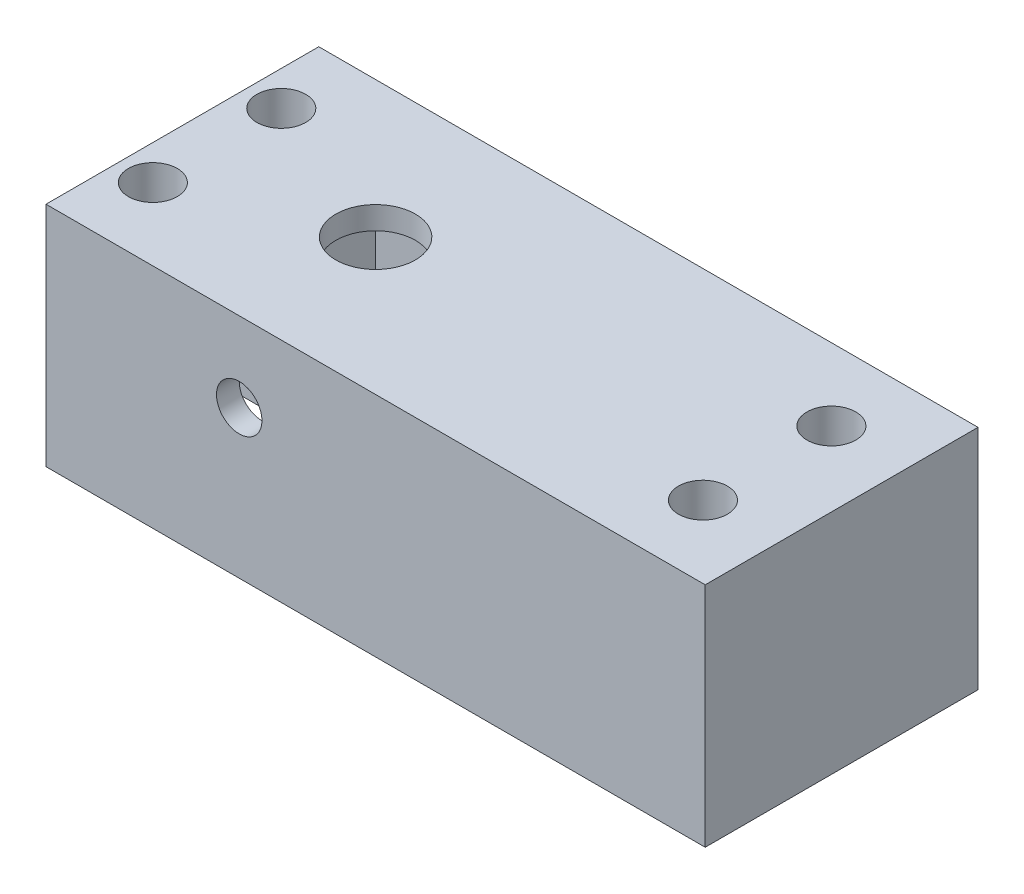
ISO-10303-21;
HEADER;
FILE_DESCRIPTION(('STEP AP214'),'2;1');
FILE_NAME('part.step','',(''),(''),'','','');
FILE_SCHEMA(('AUTOMOTIVE_DESIGN { 1 0 10303 214 1 1 1 1 }'));
ENDSEC;
DATA;
#1=APPLICATION_CONTEXT('core data for automotive mechanical design processes');
#2=APPLICATION_PROTOCOL_DEFINITION('international standard','automotive_design',2000,#1);
#3=PRODUCT_CONTEXT('',#1,'mechanical');
#4=PRODUCT('Part','Part','',(#3));
#5=PRODUCT_RELATED_PRODUCT_CATEGORY('part','',(#4));
#6=PRODUCT_DEFINITION_FORMATION('','',#4);
#7=PRODUCT_DEFINITION_CONTEXT('part definition',#1,'design');
#8=PRODUCT_DEFINITION('design','',#6,#7);
#9=PRODUCT_DEFINITION_SHAPE('','',#8);
#10=(LENGTH_UNIT() NAMED_UNIT(*) SI_UNIT(.MILLI.,.METRE.));
#11=(NAMED_UNIT(*) PLANE_ANGLE_UNIT() SI_UNIT($,.RADIAN.));
#12=(NAMED_UNIT(*) SI_UNIT($,.STERADIAN.) SOLID_ANGLE_UNIT());
#13=UNCERTAINTY_MEASURE_WITH_UNIT(LENGTH_MEASURE(1.E-05),#10,'distance_accuracy_value','');
#14=(GEOMETRIC_REPRESENTATION_CONTEXT(3) GLOBAL_UNCERTAINTY_ASSIGNED_CONTEXT((#13)) GLOBAL_UNIT_ASSIGNED_CONTEXT((#10,
#11,#12)) REPRESENTATION_CONTEXT('',''));
#15=CARTESIAN_POINT('',(0.,0.,0.));
#16=DIRECTION('',(0.,0.,1.));
#17=DIRECTION('',(1.,0.,0.));
#18=AXIS2_PLACEMENT_3D('',#15,#16,#17);
#19=CARTESIAN_POINT('',(0.,0.,2.));
#20=DIRECTION('',(0.,0.,1.));
#21=DIRECTION('',(1.,0.,0.));
#22=AXIS2_PLACEMENT_3D('',#19,#20,#21);
#23=PLANE('',#22);
#24=CARTESIAN_POINT('',(-17.348648349237,-5.,2.));
#25=DIRECTION('',(0.,0.,-1.));
#26=DIRECTION('',(-1.,0.,0.));
#27=AXIS2_PLACEMENT_3D('',#24,#25,#26);
#28=CIRCLE('',#27,2.);
#29=CARTESIAN_POINT('',(-19.348648349237,-5.,2.));
#30=VERTEX_POINT('',#29);
#31=EDGE_CURVE('E270',#30,#30,#28,.T.);
#32=ORIENTED_EDGE('',*,*,#31,.T.);
#33=EDGE_LOOP('',(#32));
#34=FACE_BOUND('',#33,.T.);
#35=DIRECTION('',(1.,0.,0.));
#36=VECTOR('',#35,1.);
#37=CARTESIAN_POINT('',(20.651351650763,-18.,2.));
#38=LINE('',#37,#36);
#39=CARTESIAN_POINT('',(-34.348648349237,-18.,2.));
#40=VERTEX_POINT('',#39);
#41=CARTESIAN_POINT('',(23.651351650763,-18.,2.));
#42=VERTEX_POINT('',#41);
#43=EDGE_CURVE('E208',#40,#42,#38,.T.);
#44=ORIENTED_EDGE('',*,*,#43,.T.);
#45=DIRECTION('',(0.,-1.,0.));
#46=VECTOR('',#45,1.);
#47=CARTESIAN_POINT('',(23.651351650763,2.,2.));
#48=LINE('',#47,#46);
#49=CARTESIAN_POINT('',(23.651351650763,2.,2.));
#50=VERTEX_POINT('',#49);
#51=EDGE_CURVE('E259',#50,#42,#48,.T.);
#52=ORIENTED_EDGE('',*,*,#51,.F.);
#53=DIRECTION('',(1.,0.,0.));
#54=VECTOR('',#53,1.);
#55=CARTESIAN_POINT('',(-34.348648349237,2.,2.));
#56=LINE('',#55,#54);
#57=CARTESIAN_POINT('',(-34.348648349237,2.,2.));
#58=VERTEX_POINT('',#57);
#59=EDGE_CURVE('E202',#58,#50,#56,.T.);
#60=ORIENTED_EDGE('',*,*,#59,.F.);
#61=DIRECTION('',(0.,-1.,0.));
#62=VECTOR('',#61,1.);
#63=CARTESIAN_POINT('',(-34.348648349237,-18.,2.));
#64=LINE('',#63,#62);
#65=EDGE_CURVE('E205',#58,#40,#64,.T.);
#66=ORIENTED_EDGE('',*,*,#65,.T.);
#67=EDGE_LOOP('',(#44,#52,#60,#66));
#68=FACE_BOUND('',#67,.T.);
#69=ADVANCED_FACE('F39',(#34,#68),#23,.T.);
#70=CARTESIAN_POINT('',(0.,0.,-22.));
#71=DIRECTION('',(0.,0.,-1.));
#72=DIRECTION('',(-1.,0.,0.));
#73=AXIS2_PLACEMENT_3D('',#70,#71,#72);
#74=PLANE('',#73);
#75=CARTESIAN_POINT('',(-17.348648349237,-5.,-22.));
#76=DIRECTION('',(0.,0.,-1.));
#77=DIRECTION('',(-1.,0.,0.));
#78=AXIS2_PLACEMENT_3D('',#75,#76,#77);
#79=CIRCLE('',#78,2.);
#80=CARTESIAN_POINT('',(-19.348648349237,-5.,-22.));
#81=VERTEX_POINT('',#80);
#82=EDGE_CURVE('E265',#81,#81,#79,.T.);
#83=ORIENTED_EDGE('',*,*,#82,.F.);
#84=EDGE_LOOP('',(#83));
#85=FACE_BOUND('',#84,.T.);
#86=DIRECTION('',(-1.,0.,0.));
#87=VECTOR('',#86,1.);
#88=CARTESIAN_POINT('',(30.651351650763,2.,-22.));
#89=LINE('',#88,#87);
#90=CARTESIAN_POINT('',(23.651351650763,2.,-22.));
#91=VERTEX_POINT('',#90);
#92=CARTESIAN_POINT('',(-34.348648349237,2.,-22.));
#93=VERTEX_POINT('',#92);
#94=EDGE_CURVE('E276',#91,#93,#89,.T.);
#95=ORIENTED_EDGE('',*,*,#94,.F.);
#96=DIRECTION('',(0.,1.,0.));
#97=VECTOR('',#96,1.);
#98=CARTESIAN_POINT('',(23.651351650763,-18.,-22.));
#99=LINE('',#98,#97);
#100=CARTESIAN_POINT('',(23.651351650763,-18.,-22.));
#101=VERTEX_POINT('',#100);
#102=EDGE_CURVE('E63',#101,#91,#99,.T.);
#103=ORIENTED_EDGE('',*,*,#102,.F.);
#104=DIRECTION('',(-1.,0.,0.));
#105=VECTOR('',#104,1.);
#106=CARTESIAN_POINT('',(-34.348648349237,-18.,-22.));
#107=LINE('',#106,#105);
#108=CARTESIAN_POINT('',(-34.348648349237,-18.,-22.));
#109=VERTEX_POINT('',#108);
#110=EDGE_CURVE('E206',#101,#109,#107,.T.);
#111=ORIENTED_EDGE('',*,*,#110,.T.);
#112=DIRECTION('',(0.,1.,0.));
#113=VECTOR('',#112,1.);
#114=CARTESIAN_POINT('',(-34.348648349237,-18.,-22.));
#115=LINE('',#114,#113);
#116=EDGE_CURVE('E201',#109,#93,#115,.T.);
#117=ORIENTED_EDGE('',*,*,#116,.T.);
#118=EDGE_LOOP('',(#95,#103,#111,#117));
#119=FACE_BOUND('',#118,.T.);
#120=ADVANCED_FACE('F228',(#85,#119),#74,.T.);
#121=CARTESIAN_POINT('',(0.,-18.,0.));
#122=DIRECTION('',(0.,-1.,0.));
#123=DIRECTION('',(0.,0.,-1.));
#124=AXIS2_PLACEMENT_3D('',#121,#122,#123);
#125=PLANE('',#124);
#126=DIRECTION('',(1.,0.,0.));
#127=VECTOR('',#126,1.);
#128=CARTESIAN_POINT('',(0.,-18.,-12.));
#129=LINE('',#128,#127);
#130=CARTESIAN_POINT('',(-34.348648349237,-18.,-12.));
#131=VERTEX_POINT('',#130);
#132=CARTESIAN_POINT('',(-27.348648349237,-18.,-12.));
#133=VERTEX_POINT('',#132);
#134=EDGE_CURVE('E139',#131,#133,#129,.T.);
#135=ORIENTED_EDGE('',*,*,#134,.F.);
#136=DIRECTION('',(0.,0.,-1.));
#137=VECTOR('',#136,1.);
#138=CARTESIAN_POINT('',(-34.348648349237,-18.,0.));
#139=LINE('',#138,#137);
#140=EDGE_CURVE('E160',#131,#109,#139,.T.);
#141=ORIENTED_EDGE('',*,*,#140,.T.);
#142=ORIENTED_EDGE('',*,*,#110,.F.);
#143=DIRECTION('',(0.,0.,-1.));
#144=VECTOR('',#143,1.);
#145=CARTESIAN_POINT('',(23.651351650763,-18.,2.));
#146=LINE('',#145,#144);
#147=EDGE_CURVE('E245',#42,#101,#146,.T.);
#148=ORIENTED_EDGE('',*,*,#147,.F.);
#149=ORIENTED_EDGE('',*,*,#43,.F.);
#150=CARTESIAN_POINT('',(-34.348648349237,-18.,-8.));
#151=VERTEX_POINT('',#150);
#152=EDGE_CURVE('E151',#40,#151,#139,.T.);
#153=ORIENTED_EDGE('',*,*,#152,.T.);
#154=DIRECTION('',(-1.,0.,0.));
#155=VECTOR('',#154,1.);
#156=CARTESIAN_POINT('',(0.,-18.,-8.));
#157=LINE('',#156,#155);
#158=CARTESIAN_POINT('',(-27.348648349237,-18.,-8.));
#159=VERTEX_POINT('',#158);
#160=EDGE_CURVE('E130',#159,#151,#157,.T.);
#161=ORIENTED_EDGE('',*,*,#160,.F.);
#162=DIRECTION('',(0.,0.,1.));
#163=VECTOR('',#162,1.);
#164=CARTESIAN_POINT('',(-27.348648349237,-18.,0.));
#165=LINE('',#164,#163);
#166=CARTESIAN_POINT('',(-27.348648349237,-18.,0.));
#167=VERTEX_POINT('',#166);
#168=EDGE_CURVE('E147',#159,#167,#165,.T.);
#169=ORIENTED_EDGE('',*,*,#168,.T.);
#170=DIRECTION('',(1.,0.,0.));
#171=VECTOR('',#170,1.);
#172=CARTESIAN_POINT('',(20.651351650763,-18.,0.));
#173=LINE('',#172,#171);
#174=CARTESIAN_POINT('',(13.651351650763,-18.,0.));
#175=VERTEX_POINT('',#174);
#176=EDGE_CURVE('E204',#167,#175,#173,.T.);
#177=ORIENTED_EDGE('',*,*,#176,.T.);
#178=DIRECTION('',(0.,0.,-1.));
#179=VECTOR('',#178,1.);
#180=CARTESIAN_POINT('',(13.651351650763,-18.,-20.));
#181=LINE('',#180,#179);
#182=CARTESIAN_POINT('',(13.651351650763,-18.,-20.));
#183=VERTEX_POINT('',#182);
#184=EDGE_CURVE('E186',#175,#183,#181,.T.);
#185=ORIENTED_EDGE('',*,*,#184,.T.);
#186=DIRECTION('',(-1.,0.,0.));
#187=VECTOR('',#186,1.);
#188=CARTESIAN_POINT('',(-34.348648349237,-18.,-20.));
#189=LINE('',#188,#187);
#190=CARTESIAN_POINT('',(-27.348648349237,-18.,-20.));
#191=VERTEX_POINT('',#190);
#192=EDGE_CURVE('E199',#183,#191,#189,.T.);
#193=ORIENTED_EDGE('',*,*,#192,.T.);
#194=EDGE_CURVE('E157',#191,#133,#165,.T.);
#195=ORIENTED_EDGE('',*,*,#194,.T.);
#196=EDGE_LOOP('',(#135,#141,#142,#148,#149,#153,#161,#169,#177,#185,#193,#195));
#197=FACE_BOUND('',#196,.T.);
#198=CARTESIAN_POINT('',(-31.2986483492361,-18.,-4.3499999999994));
#199=DIRECTION('',(0.,-1.,0.));
#200=DIRECTION('',(0.,0.,-1.));
#201=AXIS2_PLACEMENT_3D('',#198,#199,#200);
#202=CIRCLE('',#201,2.14999999999999);
#203=CARTESIAN_POINT('',(-31.2986483492361,-18.,-6.49999999999939));
#204=VERTEX_POINT('',#203);
#205=EDGE_CURVE('E193',#204,#204,#202,.T.);
#206=ORIENTED_EDGE('',*,*,#205,.F.);
#207=EDGE_LOOP('',(#206));
#208=FACE_BOUND('',#207,.T.);
#209=CARTESIAN_POINT('',(-31.2986483492361,-18.,-15.6499999999994));
#210=DIRECTION('',(0.,-1.,0.));
#211=DIRECTION('',(0.,0.,-1.));
#212=AXIS2_PLACEMENT_3D('',#209,#210,#211);
#213=CIRCLE('',#212,2.14999999999999);
#214=CARTESIAN_POINT('',(-31.2986483492361,-18.,-17.7999999999994));
#215=VERTEX_POINT('',#214);
#216=EDGE_CURVE('E189',#215,#215,#213,.T.);
#217=ORIENTED_EDGE('',*,*,#216,.F.);
#218=EDGE_LOOP('',(#217));
#219=FACE_BOUND('',#218,.T.);
#220=CARTESIAN_POINT('',(17.101351650764,-18.,-4.34999999999941));
#221=DIRECTION('',(0.,-1.,0.));
#222=DIRECTION('',(0.,0.,-1.));
#223=AXIS2_PLACEMENT_3D('',#220,#221,#222);
#224=CIRCLE('',#223,2.15);
#225=CARTESIAN_POINT('',(17.101351650764,-18.,-6.49999999999941));
#226=VERTEX_POINT('',#225);
#227=EDGE_CURVE('E214',#226,#226,#224,.T.);
#228=ORIENTED_EDGE('',*,*,#227,.F.);
#229=EDGE_LOOP('',(#228));
#230=FACE_BOUND('',#229,.T.);
#231=CARTESIAN_POINT('',(17.1013516507639,-18.,-15.6499999999994));
#232=DIRECTION('',(0.,-1.,0.));
#233=DIRECTION('',(0.,0.,-1.));
#234=AXIS2_PLACEMENT_3D('',#231,#232,#233);
#235=CIRCLE('',#234,2.15);
#236=CARTESIAN_POINT('',(17.1013516507639,-18.,-17.7999999999994));
#237=VERTEX_POINT('',#236);
#238=EDGE_CURVE('E217',#237,#237,#235,.T.);
#239=ORIENTED_EDGE('',*,*,#238,.F.);
#240=EDGE_LOOP('',(#239));
#241=FACE_BOUND('',#240,.T.);
#242=ADVANCED_FACE('F144',(#197,#208,#219,#230,#241),#125,.T.);
#243=CARTESIAN_POINT('',(0.,2.,0.));
#244=DIRECTION('',(0.,1.,0.));
#245=DIRECTION('',(0.,0.,1.));
#246=AXIS2_PLACEMENT_3D('',#243,#244,#245);
#247=PLANE('',#246);
#248=CARTESIAN_POINT('',(17.101351650764,2.,-4.34999999999941));
#249=DIRECTION('',(0.,-1.,0.));
#250=DIRECTION('',(0.,0.,-1.));
#251=AXIS2_PLACEMENT_3D('',#248,#249,#250);
#252=CIRCLE('',#251,2.15);
#253=CARTESIAN_POINT('',(17.101351650764,2.,-6.49999999999941));
#254=VERTEX_POINT('',#253);
#255=EDGE_CURVE('E246',#254,#254,#252,.T.);
#256=ORIENTED_EDGE('',*,*,#255,.T.);
#257=EDGE_LOOP('',(#256));
#258=FACE_BOUND('',#257,.T.);
#259=CARTESIAN_POINT('',(-31.2986483492361,2.,-15.6499999999994));
#260=DIRECTION('',(0.,-1.,0.));
#261=DIRECTION('',(0.,0.,-1.));
#262=AXIS2_PLACEMENT_3D('',#259,#260,#261);
#263=CIRCLE('',#262,2.14999999999999);
#264=CARTESIAN_POINT('',(-31.2986483492361,2.,-17.7999999999994));
#265=VERTEX_POINT('',#264);
#266=EDGE_CURVE('E250',#265,#265,#263,.T.);
#267=ORIENTED_EDGE('',*,*,#266,.T.);
#268=EDGE_LOOP('',(#267));
#269=FACE_BOUND('',#268,.T.);
#270=CARTESIAN_POINT('',(-31.2986483492361,2.,-4.3499999999994));
#271=DIRECTION('',(0.,-1.,0.));
#272=DIRECTION('',(0.,0.,-1.));
#273=AXIS2_PLACEMENT_3D('',#270,#271,#272);
#274=CIRCLE('',#273,2.14999999999999);
#275=CARTESIAN_POINT('',(-31.2986483492361,2.,-6.49999999999939));
#276=VERTEX_POINT('',#275);
#277=EDGE_CURVE('E253',#276,#276,#274,.T.);
#278=ORIENTED_EDGE('',*,*,#277,.T.);
#279=EDGE_LOOP('',(#278));
#280=FACE_BOUND('',#279,.T.);
#281=CARTESIAN_POINT('',(17.1013516507639,2.,-15.6499999999994));
#282=DIRECTION('',(0.,-1.,0.));
#283=DIRECTION('',(0.,0.,-1.));
#284=AXIS2_PLACEMENT_3D('',#281,#282,#283);
#285=CIRCLE('',#284,2.15);
#286=CARTESIAN_POINT('',(17.1013516507639,2.,-17.7999999999994));
#287=VERTEX_POINT('',#286);
#288=EDGE_CURVE('E243',#287,#287,#285,.T.);
#289=ORIENTED_EDGE('',*,*,#288,.T.);
#290=EDGE_LOOP('',(#289));
#291=FACE_BOUND('',#290,.T.);
#292=CARTESIAN_POINT('',(-17.348648349237,2.,-10.));
#293=DIRECTION('',(0.,-1.,0.));
#294=DIRECTION('',(0.,0.,-1.));
#295=AXIS2_PLACEMENT_3D('',#292,#293,#294);
#296=CIRCLE('',#295,3.5);
#297=CARTESIAN_POINT('',(-17.348648349237,2.,-13.5));
#298=VERTEX_POINT('',#297);
#299=EDGE_CURVE('E262',#298,#298,#296,.T.);
#300=ORIENTED_EDGE('',*,*,#299,.T.);
#301=EDGE_LOOP('',(#300));
#302=FACE_BOUND('',#301,.T.);
#303=ORIENTED_EDGE('',*,*,#59,.T.);
#304=DIRECTION('',(0.,0.,1.));
#305=VECTOR('',#304,1.);
#306=CARTESIAN_POINT('',(23.651351650763,2.,-22.));
#307=LINE('',#306,#305);
#308=EDGE_CURVE('E257',#91,#50,#307,.T.);
#309=ORIENTED_EDGE('',*,*,#308,.F.);
#310=ORIENTED_EDGE('',*,*,#94,.T.);
#311=DIRECTION('',(0.,0.,1.));
#312=VECTOR('',#311,1.);
#313=CARTESIAN_POINT('',(-34.348648349237,2.,-22.));
#314=LINE('',#313,#312);
#315=EDGE_CURVE('E278',#93,#58,#314,.T.);
#316=ORIENTED_EDGE('',*,*,#315,.T.);
#317=EDGE_LOOP('',(#303,#309,#310,#316));
#318=FACE_BOUND('',#317,.T.);
#319=ADVANCED_FACE('F227',(#258,#269,#280,#291,#302,#318),#247,.T.);
#320=CARTESIAN_POINT('',(-34.348648349237,7.,0.));
#321=DIRECTION('',(1.,0.,0.));
#322=DIRECTION('',(0.,0.,-1.));
#323=AXIS2_PLACEMENT_3D('',#320,#321,#322);
#324=PLANE('',#323);
#325=ORIENTED_EDGE('',*,*,#140,.F.);
#326=DIRECTION('',(0.,-1.,0.));
#327=VECTOR('',#326,1.);
#328=CARTESIAN_POINT('',(-34.348648349237,8.06225774829855,-12.));
#329=LINE('',#328,#327);
#330=CARTESIAN_POINT('',(-34.348648349237,-1.,-12.));
#331=VERTEX_POINT('',#330);
#332=EDGE_CURVE('E304',#331,#131,#329,.T.);
#333=ORIENTED_EDGE('',*,*,#332,.F.);
#334=DIRECTION('',(0.,0.,1.));
#335=VECTOR('',#334,1.);
#336=CARTESIAN_POINT('',(-34.348648349237,-1.,0.));
#337=LINE('',#336,#335);
#338=CARTESIAN_POINT('',(-34.348648349237,-1.,-8.));
#339=VERTEX_POINT('',#338);
#340=EDGE_CURVE('E303',#331,#339,#337,.T.);
#341=ORIENTED_EDGE('',*,*,#340,.T.);
#342=DIRECTION('',(0.,-1.,0.));
#343=VECTOR('',#342,1.);
#344=CARTESIAN_POINT('',(-34.348648349237,8.06225774829855,-8.));
#345=LINE('',#344,#343);
#346=EDGE_CURVE('E138',#339,#151,#345,.T.);
#347=ORIENTED_EDGE('',*,*,#346,.T.);
#348=ORIENTED_EDGE('',*,*,#152,.F.);
#349=ORIENTED_EDGE('',*,*,#65,.F.);
#350=ORIENTED_EDGE('',*,*,#315,.F.);
#351=ORIENTED_EDGE('',*,*,#116,.F.);
#352=EDGE_LOOP('',(#325,#333,#341,#347,#348,#349,#350,#351));
#353=FACE_BOUND('',#352,.T.);
#354=ADVANCED_FACE('F41',(#353),#324,.F.);
#355=CARTESIAN_POINT('',(0.,0.,0.));
#356=DIRECTION('',(0.,-1.,0.));
#357=DIRECTION('',(0.,0.,-1.));
#358=AXIS2_PLACEMENT_3D('',#355,#356,#357);
#359=PLANE('',#358);
#360=CARTESIAN_POINT('',(-17.348648349237,0.,-10.));
#361=DIRECTION('',(0.,-1.,0.));
#362=DIRECTION('',(0.,0.,-1.));
#363=AXIS2_PLACEMENT_3D('',#360,#361,#362);
#364=CIRCLE('',#363,3.5);
#365=CARTESIAN_POINT('',(-17.348648349237,0.,-13.5));
#366=VERTEX_POINT('',#365);
#367=EDGE_CURVE('E261',#366,#366,#364,.T.);
#368=ORIENTED_EDGE('',*,*,#367,.F.);
#369=EDGE_LOOP('',(#368));
#370=FACE_BOUND('',#369,.T.);
#371=DIRECTION('',(-1.,0.,0.));
#372=VECTOR('',#371,1.);
#373=CARTESIAN_POINT('',(-34.348648349237,0.,-20.));
#374=LINE('',#373,#372);
#375=CARTESIAN_POINT('',(13.651351650763,0.,-20.));
#376=VERTEX_POINT('',#375);
#377=CARTESIAN_POINT('',(-27.348648349237,0.,-20.));
#378=VERTEX_POINT('',#377);
#379=EDGE_CURVE('E13',#376,#378,#374,.T.);
#380=ORIENTED_EDGE('',*,*,#379,.F.);
#381=DIRECTION('',(0.,0.,-1.));
#382=VECTOR('',#381,1.);
#383=CARTESIAN_POINT('',(13.651351650763,0.,-20.));
#384=LINE('',#383,#382);
#385=CARTESIAN_POINT('',(13.651351650763,0.,0.));
#386=VERTEX_POINT('',#385);
#387=EDGE_CURVE('E183',#386,#376,#384,.T.);
#388=ORIENTED_EDGE('',*,*,#387,.F.);
#389=DIRECTION('',(1.,0.,0.));
#390=VECTOR('',#389,1.);
#391=CARTESIAN_POINT('',(-34.348648349237,0.,0.));
#392=LINE('',#391,#390);
#393=CARTESIAN_POINT('',(-27.348648349237,0.,0.));
#394=VERTEX_POINT('',#393);
#395=EDGE_CURVE('E48',#394,#386,#392,.T.);
#396=ORIENTED_EDGE('',*,*,#395,.F.);
#397=DIRECTION('',(0.,0.,1.));
#398=VECTOR('',#397,1.);
#399=CARTESIAN_POINT('',(-27.348648349237,0.,0.));
#400=LINE('',#399,#398);
#401=EDGE_CURVE('E164',#378,#394,#400,.T.);
#402=ORIENTED_EDGE('',*,*,#401,.F.);
#403=EDGE_LOOP('',(#380,#388,#396,#402));
#404=FACE_BOUND('',#403,.T.);
#405=ADVANCED_FACE('F188',(#370,#404),#359,.T.);
#406=CARTESIAN_POINT('',(-27.348648349237,-18.,0.));
#407=DIRECTION('',(-1.,0.,0.));
#408=DIRECTION('',(0.,0.,1.));
#409=AXIS2_PLACEMENT_3D('',#406,#407,#408);
#410=PLANE('',#409);
#411=DIRECTION('',(0.,0.,-1.));
#412=VECTOR('',#411,1.);
#413=CARTESIAN_POINT('',(-27.348648349237,-1.,0.));
#414=LINE('',#413,#412);
#415=CARTESIAN_POINT('',(-27.348648349237,-1.,-8.));
#416=VERTEX_POINT('',#415);
#417=CARTESIAN_POINT('',(-27.348648349237,-1.,-12.));
#418=VERTEX_POINT('',#417);
#419=EDGE_CURVE('E307',#416,#418,#414,.T.);
#420=ORIENTED_EDGE('',*,*,#419,.T.);
#421=DIRECTION('',(0.,-1.,0.));
#422=VECTOR('',#421,1.);
#423=CARTESIAN_POINT('',(-27.348648349237,8.06225774829855,-12.));
#424=LINE('',#423,#422);
#425=EDGE_CURVE('E55',#418,#133,#424,.T.);
#426=ORIENTED_EDGE('',*,*,#425,.T.);
#427=ORIENTED_EDGE('',*,*,#194,.F.);
#428=DIRECTION('',(0.,1.,0.));
#429=VECTOR('',#428,1.);
#430=CARTESIAN_POINT('',(-27.348648349237,-18.,-20.));
#431=LINE('',#430,#429);
#432=EDGE_CURVE('E168',#191,#378,#431,.T.);
#433=ORIENTED_EDGE('',*,*,#432,.T.);
#434=ORIENTED_EDGE('',*,*,#401,.T.);
#435=DIRECTION('',(0.,1.,0.));
#436=VECTOR('',#435,1.);
#437=CARTESIAN_POINT('',(-27.348648349237,-18.,0.));
#438=LINE('',#437,#436);
#439=EDGE_CURVE('E156',#167,#394,#438,.T.);
#440=ORIENTED_EDGE('',*,*,#439,.F.);
#441=ORIENTED_EDGE('',*,*,#168,.F.);
#442=DIRECTION('',(0.,-1.,0.));
#443=VECTOR('',#442,1.);
#444=CARTESIAN_POINT('',(-27.348648349237,8.06225774829855,-8.));
#445=LINE('',#444,#443);
#446=EDGE_CURVE('E127',#416,#159,#445,.T.);
#447=ORIENTED_EDGE('',*,*,#446,.F.);
#448=EDGE_LOOP('',(#420,#426,#427,#433,#434,#440,#441,#447));
#449=FACE_BOUND('',#448,.T.);
#450=ADVANCED_FACE('F154',(#449),#410,.F.);
#451=CARTESIAN_POINT('',(13.651351650763,-18.,-20.));
#452=DIRECTION('',(1.,0.,0.));
#453=DIRECTION('',(0.,0.,-1.));
#454=AXIS2_PLACEMENT_3D('',#451,#452,#453);
#455=PLANE('',#454);
#456=ORIENTED_EDGE('',*,*,#387,.T.);
#457=DIRECTION('',(0.,1.,0.));
#458=VECTOR('',#457,1.);
#459=CARTESIAN_POINT('',(13.651351650763,-18.,-20.));
#460=LINE('',#459,#458);
#461=EDGE_CURVE('E187',#183,#376,#460,.T.);
#462=ORIENTED_EDGE('',*,*,#461,.F.);
#463=ORIENTED_EDGE('',*,*,#184,.F.);
#464=DIRECTION('',(0.,1.,0.));
#465=VECTOR('',#464,1.);
#466=CARTESIAN_POINT('',(13.651351650763,-18.,0.));
#467=LINE('',#466,#465);
#468=EDGE_CURVE('E166',#175,#386,#467,.T.);
#469=ORIENTED_EDGE('',*,*,#468,.T.);
#470=EDGE_LOOP('',(#456,#462,#463,#469));
#471=FACE_BOUND('',#470,.T.);
#472=ADVANCED_FACE('F181',(#471),#455,.F.);
#473=CARTESIAN_POINT('',(-31.2986483492361,-11.,-15.6499999999994));
#474=DIRECTION('',(0.,-1.,0.));
#475=DIRECTION('',(0.,0.,-1.));
#476=AXIS2_PLACEMENT_3D('',#473,#474,#475);
#477=CYLINDRICAL_SURFACE('',#476,2.14999999999999);
#478=ORIENTED_EDGE('',*,*,#216,.T.);
#479=EDGE_LOOP('',(#478));
#480=FACE_BOUND('',#479,.T.);
#481=ORIENTED_EDGE('',*,*,#266,.F.);
#482=EDGE_LOOP('',(#481));
#483=FACE_BOUND('',#482,.T.);
#484=ADVANCED_FACE('F315',(#480,#483),#477,.F.);
#485=CARTESIAN_POINT('',(-31.2986483492361,-11.,-4.3499999999994));
#486=DIRECTION('',(0.,-1.,0.));
#487=DIRECTION('',(0.,0.,-1.));
#488=AXIS2_PLACEMENT_3D('',#485,#486,#487);
#489=CYLINDRICAL_SURFACE('',#488,2.14999999999999);
#490=ORIENTED_EDGE('',*,*,#205,.T.);
#491=EDGE_LOOP('',(#490));
#492=FACE_BOUND('',#491,.T.);
#493=ORIENTED_EDGE('',*,*,#277,.F.);
#494=EDGE_LOOP('',(#493));
#495=FACE_BOUND('',#494,.T.);
#496=ADVANCED_FACE('F223',(#492,#495),#489,.F.);
#497=CARTESIAN_POINT('',(17.1013516507639,-11.,-15.6499999999994));
#498=DIRECTION('',(0.,-1.,0.));
#499=DIRECTION('',(0.,0.,-1.));
#500=AXIS2_PLACEMENT_3D('',#497,#498,#499);
#501=CYLINDRICAL_SURFACE('',#500,2.15);
#502=ORIENTED_EDGE('',*,*,#238,.T.);
#503=EDGE_LOOP('',(#502));
#504=FACE_BOUND('',#503,.T.);
#505=ORIENTED_EDGE('',*,*,#288,.F.);
#506=EDGE_LOOP('',(#505));
#507=FACE_BOUND('',#506,.T.);
#508=ADVANCED_FACE('F236',(#504,#507),#501,.F.);
#509=CARTESIAN_POINT('',(17.101351650764,-11.,-4.34999999999941));
#510=DIRECTION('',(0.,-1.,0.));
#511=DIRECTION('',(0.,0.,-1.));
#512=AXIS2_PLACEMENT_3D('',#509,#510,#511);
#513=CYLINDRICAL_SURFACE('',#512,2.15);
#514=ORIENTED_EDGE('',*,*,#227,.T.);
#515=EDGE_LOOP('',(#514));
#516=FACE_BOUND('',#515,.T.);
#517=ORIENTED_EDGE('',*,*,#255,.F.);
#518=EDGE_LOOP('',(#517));
#519=FACE_BOUND('',#518,.T.);
#520=ADVANCED_FACE('F239',(#516,#519),#513,.F.);
#521=CARTESIAN_POINT('',(0.,0.,0.));
#522=DIRECTION('',(0.,0.,1.));
#523=DIRECTION('',(1.,0.,0.));
#524=AXIS2_PLACEMENT_3D('',#521,#522,#523);
#525=PLANE('',#524);
#526=CARTESIAN_POINT('',(-17.348648349237,-5.,0.));
#527=DIRECTION('',(0.,0.,1.));
#528=DIRECTION('',(1.,0.,0.));
#529=AXIS2_PLACEMENT_3D('',#526,#527,#528);
#530=CIRCLE('',#529,2.);
#531=CARTESIAN_POINT('',(-15.348648349237,-5.,0.));
#532=VERTEX_POINT('',#531);
#533=EDGE_CURVE('E273',#532,#532,#530,.T.);
#534=ORIENTED_EDGE('',*,*,#533,.T.);
#535=EDGE_LOOP('',(#534));
#536=FACE_BOUND('',#535,.T.);
#537=ORIENTED_EDGE('',*,*,#176,.F.);
#538=ORIENTED_EDGE('',*,*,#439,.T.);
#539=ORIENTED_EDGE('',*,*,#395,.T.);
#540=ORIENTED_EDGE('',*,*,#468,.F.);
#541=EDGE_LOOP('',(#537,#538,#539,#540));
#542=FACE_BOUND('',#541,.T.);
#543=ADVANCED_FACE('F174',(#536,#542),#525,.F.);
#544=CARTESIAN_POINT('',(0.,0.,-20.));
#545=DIRECTION('',(0.,0.,-1.));
#546=DIRECTION('',(-1.,0.,0.));
#547=AXIS2_PLACEMENT_3D('',#544,#545,#546);
#548=PLANE('',#547);
#549=CARTESIAN_POINT('',(-17.348648349237,-5.,-20.));
#550=DIRECTION('',(0.,0.,-1.));
#551=DIRECTION('',(-1.,0.,0.));
#552=AXIS2_PLACEMENT_3D('',#549,#550,#551);
#553=CIRCLE('',#552,2.);
#554=CARTESIAN_POINT('',(-19.348648349237,-5.,-20.));
#555=VERTEX_POINT('',#554);
#556=EDGE_CURVE('E43',#555,#555,#553,.T.);
#557=ORIENTED_EDGE('',*,*,#556,.T.);
#558=EDGE_LOOP('',(#557));
#559=FACE_BOUND('',#558,.T.);
#560=ORIENTED_EDGE('',*,*,#192,.F.);
#561=ORIENTED_EDGE('',*,*,#461,.T.);
#562=ORIENTED_EDGE('',*,*,#379,.T.);
#563=ORIENTED_EDGE('',*,*,#432,.F.);
#564=EDGE_LOOP('',(#560,#561,#562,#563));
#565=FACE_BOUND('',#564,.T.);
#566=ADVANCED_FACE('F197',(#559,#565),#548,.F.);
#567=CARTESIAN_POINT('',(-17.348648349237,-5.,2.));
#568=DIRECTION('',(0.,0.,-1.));
#569=DIRECTION('',(-1.,0.,0.));
#570=AXIS2_PLACEMENT_3D('',#567,#568,#569);
#571=CYLINDRICAL_SURFACE('',#570,2.);
#572=ORIENTED_EDGE('',*,*,#82,.T.);
#573=EDGE_LOOP('',(#572));
#574=FACE_BOUND('',#573,.T.);
#575=ORIENTED_EDGE('',*,*,#556,.F.);
#576=EDGE_LOOP('',(#575));
#577=FACE_BOUND('',#576,.T.);
#578=ADVANCED_FACE('F352',(#574,#577),#571,.F.);
#579=ORIENTED_EDGE('',*,*,#31,.F.);
#580=EDGE_LOOP('',(#579));
#581=FACE_BOUND('',#580,.T.);
#582=ORIENTED_EDGE('',*,*,#533,.F.);
#583=EDGE_LOOP('',(#582));
#584=FACE_BOUND('',#583,.T.);
#585=ADVANCED_FACE('F348',(#581,#584),#571,.F.);
#586=CARTESIAN_POINT('',(-17.348648349237,2.,-10.));
#587=DIRECTION('',(0.,-1.,0.));
#588=DIRECTION('',(0.,0.,-1.));
#589=AXIS2_PLACEMENT_3D('',#586,#587,#588);
#590=CYLINDRICAL_SURFACE('',#589,3.5);
#591=ORIENTED_EDGE('',*,*,#299,.F.);
#592=EDGE_LOOP('',(#591));
#593=FACE_BOUND('',#592,.T.);
#594=ORIENTED_EDGE('',*,*,#367,.T.);
#595=EDGE_LOOP('',(#594));
#596=FACE_BOUND('',#595,.T.);
#597=ADVANCED_FACE('F351',(#593,#596),#590,.F.);
#598=CARTESIAN_POINT('',(23.651351650763,0.,0.));
#599=DIRECTION('',(1.,0.,0.));
#600=DIRECTION('',(0.,0.,-1.));
#601=AXIS2_PLACEMENT_3D('',#598,#599,#600);
#602=PLANE('',#601);
#603=ORIENTED_EDGE('',*,*,#147,.T.);
#604=ORIENTED_EDGE('',*,*,#102,.T.);
#605=ORIENTED_EDGE('',*,*,#308,.T.);
#606=ORIENTED_EDGE('',*,*,#51,.T.);
#607=EDGE_LOOP('',(#603,#604,#605,#606));
#608=FACE_BOUND('',#607,.T.);
#609=ADVANCED_FACE('F298',(#608),#602,.T.);
#610=CARTESIAN_POINT('',(0.,8.06225774829855,-12.));
#611=DIRECTION('',(0.,0.,-1.));
#612=DIRECTION('',(-1.,0.,0.));
#613=AXIS2_PLACEMENT_3D('',#610,#611,#612);
#614=PLANE('',#613);
#615=DIRECTION('',(-1.,0.,0.));
#616=VECTOR('',#615,1.);
#617=CARTESIAN_POINT('',(0.,-1.,-12.));
#618=LINE('',#617,#616);
#619=EDGE_CURVE('E371',#418,#331,#618,.T.);
#620=ORIENTED_EDGE('',*,*,#619,.T.);
#621=ORIENTED_EDGE('',*,*,#332,.T.);
#622=ORIENTED_EDGE('',*,*,#134,.T.);
#623=ORIENTED_EDGE('',*,*,#425,.F.);
#624=EDGE_LOOP('',(#620,#621,#622,#623));
#625=FACE_BOUND('',#624,.T.);
#626=ADVANCED_FACE('F359',(#625),#614,.F.);
#627=CARTESIAN_POINT('',(0.,8.06225774829855,-8.));
#628=DIRECTION('',(0.,0.,1.));
#629=DIRECTION('',(1.,0.,0.));
#630=AXIS2_PLACEMENT_3D('',#627,#628,#629);
#631=PLANE('',#630);
#632=DIRECTION('',(1.,0.,0.));
#633=VECTOR('',#632,1.);
#634=CARTESIAN_POINT('',(0.,-1.,-8.));
#635=LINE('',#634,#633);
#636=EDGE_CURVE('E133',#339,#416,#635,.T.);
#637=ORIENTED_EDGE('',*,*,#636,.T.);
#638=ORIENTED_EDGE('',*,*,#446,.T.);
#639=ORIENTED_EDGE('',*,*,#160,.T.);
#640=ORIENTED_EDGE('',*,*,#346,.F.);
#641=EDGE_LOOP('',(#637,#638,#639,#640));
#642=FACE_BOUND('',#641,.T.);
#643=ADVANCED_FACE('F129',(#642),#631,.F.);
#644=CARTESIAN_POINT('',(0.,-1.,0.));
#645=DIRECTION('',(0.,-1.,0.));
#646=DIRECTION('',(0.,0.,-1.));
#647=AXIS2_PLACEMENT_3D('',#644,#645,#646);
#648=PLANE('',#647);
#649=ORIENTED_EDGE('',*,*,#419,.F.);
#650=ORIENTED_EDGE('',*,*,#636,.F.);
#651=ORIENTED_EDGE('',*,*,#340,.F.);
#652=ORIENTED_EDGE('',*,*,#619,.F.);
#653=EDGE_LOOP('',(#649,#650,#651,#652));
#654=FACE_BOUND('',#653,.T.);
#655=ADVANCED_FACE('F362',(#654),#648,.T.);
#656=CLOSED_SHELL('',(#69,#120,#242,#319,#354,#405,#450,#472,#484,#496,#508,#520,#543,#566,#578,
#585,#597,#609,#626,#643,#655));
#657=MANIFOLD_SOLID_BREP('B2',#656);
#658=ADVANCED_BREP_SHAPE_REPRESENTATION('',(#18,#657),#14);
#659=SHAPE_DEFINITION_REPRESENTATION(#9,#658);
ENDSEC;
END-ISO-10303-21;
